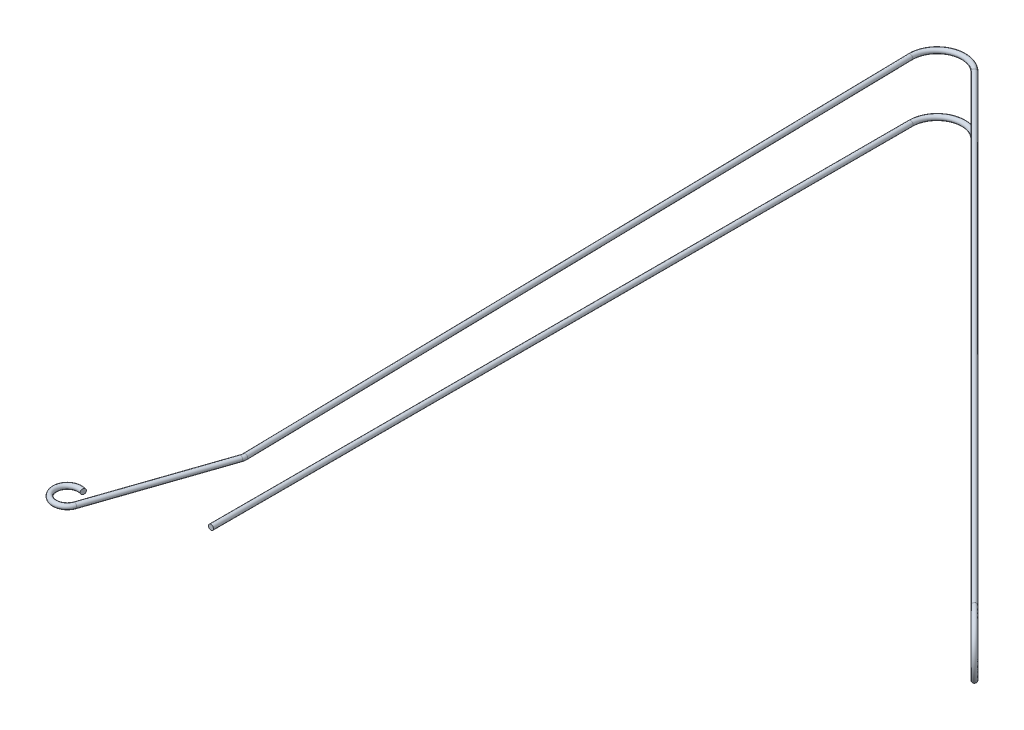
ISO-10303-21;
HEADER;
FILE_DESCRIPTION(('STEP AP214'),'2;1');
FILE_NAME('part.step','',(''),(''),'','','');
FILE_SCHEMA(('AUTOMOTIVE_DESIGN { 1 0 10303 214 1 1 1 1 }'));
ENDSEC;
DATA;
#1=APPLICATION_CONTEXT('core data for automotive mechanical design processes');
#2=APPLICATION_PROTOCOL_DEFINITION('international standard','automotive_design',2000,#1);
#3=PRODUCT_CONTEXT('',#1,'mechanical');
#4=PRODUCT('Part','Part','',(#3));
#5=PRODUCT_RELATED_PRODUCT_CATEGORY('part','',(#4));
#6=PRODUCT_DEFINITION_FORMATION('','',#4);
#7=PRODUCT_DEFINITION_CONTEXT('part definition',#1,'design');
#8=PRODUCT_DEFINITION('design','',#6,#7);
#9=PRODUCT_DEFINITION_SHAPE('','',#8);
#10=(LENGTH_UNIT() NAMED_UNIT(*) SI_UNIT(.MILLI.,.METRE.));
#11=(NAMED_UNIT(*) PLANE_ANGLE_UNIT() SI_UNIT($,.RADIAN.));
#12=(NAMED_UNIT(*) SI_UNIT($,.STERADIAN.) SOLID_ANGLE_UNIT());
#13=UNCERTAINTY_MEASURE_WITH_UNIT(LENGTH_MEASURE(1.E-05),#10,'distance_accuracy_value','');
#14=(GEOMETRIC_REPRESENTATION_CONTEXT(3) GLOBAL_UNCERTAINTY_ASSIGNED_CONTEXT((#13)) GLOBAL_UNIT_ASSIGNED_CONTEXT((#10,
#11,#12)) REPRESENTATION_CONTEXT('',''));
#15=CARTESIAN_POINT('',(0.,0.,0.));
#16=DIRECTION('',(0.,0.,1.));
#17=DIRECTION('',(1.,0.,0.));
#18=AXIS2_PLACEMENT_3D('',#15,#16,#17);
#19=CARTESIAN_POINT('',(0.,0.,0.));
#20=DIRECTION('',(0.,0.,1.));
#21=DIRECTION('',(1.,0.,0.));
#22=AXIS2_PLACEMENT_3D('',#19,#20,#21);
#23=PLANE('',#22);
#24=CARTESIAN_POINT('',(0.,0.,0.));
#25=DIRECTION('',(0.,0.,1.));
#26=DIRECTION('',(1.,0.,0.));
#27=AXIS2_PLACEMENT_3D('',#24,#25,#26);
#28=CIRCLE('',#27,10.);
#29=CARTESIAN_POINT('',(10.,0.,0.));
#30=VERTEX_POINT('',#29);
#31=EDGE_CURVE('E56',#30,#30,#28,.T.);
#32=ORIENTED_EDGE('',*,*,#31,.T.);
#33=EDGE_LOOP('',(#32));
#34=FACE_BOUND('',#33,.T.);
#35=ADVANCED_FACE('F42',(#34),#23,.T.);
#36=CARTESIAN_POINT('',(0.,0.,0.));
#37=DIRECTION('',(0.,0.,-1.));
#38=DIRECTION('',(-1.,0.,0.));
#39=AXIS2_PLACEMENT_3D('',#36,#37,#38);
#40=CYLINDRICAL_SURFACE('',#39,10.);
#41=CARTESIAN_POINT('',(0.,0.,-2783.));
#42=DIRECTION('',(0.,0.,1.));
#43=DIRECTION('',(1.,0.,0.));
#44=AXIS2_PLACEMENT_3D('',#41,#42,#43);
#45=CIRCLE('',#44,10.);
#46=CARTESIAN_POINT('',(-10.0000000000001,0.,-2783.));
#47=VERTEX_POINT('',#46);
#48=EDGE_CURVE('E52',#47,#47,#45,.T.);
#49=ORIENTED_EDGE('',*,*,#48,.T.);
#50=EDGE_LOOP('',(#49));
#51=FACE_BOUND('',#50,.T.);
#52=ORIENTED_EDGE('',*,*,#31,.F.);
#53=EDGE_LOOP('',(#52));
#54=FACE_BOUND('',#53,.T.);
#55=ADVANCED_FACE('F112',(#51,#54),#40,.T.);
#56=CARTESIAN_POINT('',(105.,0.,-2783.));
#57=DIRECTION('',(0.,-1.,0.));
#58=DIRECTION('',(0.,0.,-1.));
#59=AXIS2_PLACEMENT_3D('',#56,#57,#58);
#60=TOROIDAL_SURFACE('',#59,105.,10.);
#61=CARTESIAN_POINT('',(179.246212024588,0.,-2857.24621202459));
#62=DIRECTION('',(-0.707106781186545,0.,-0.70710678118655));
#63=DIRECTION('',(-0.70710678118655,0.,0.707106781186545));
#64=AXIS2_PLACEMENT_3D('',#61,#62,#63);
#65=CIRCLE('',#64,10.);
#66=CARTESIAN_POINT('',(186.317279836453,0.,-2864.31727983645));
#67=VERTEX_POINT('',#66);
#68=EDGE_CURVE('E48',#67,#67,#65,.T.);
#69=CARTESIAN_POINT('',(105.,0.,-2783.));
#70=DIRECTION('',(0.,-1.,0.));
#71=DIRECTION('',(0.,0.,-1.));
#72=AXIS2_PLACEMENT_3D('',#69,#70,#71);
#73=CIRCLE('',#72,115.);
#74=EDGE_CURVE('',#47,#67,#73,.T.);
#75=ORIENTED_EDGE('',*,*,#48,.F.);
#76=ORIENTED_EDGE('',*,*,#68,.T.);
#77=ORIENTED_EDGE('',*,*,#74,.T.);
#78=ORIENTED_EDGE('',*,*,#74,.F.);
#79=EDGE_LOOP('',(#75,#77,#76,#78));
#80=FACE_BOUND('',#79,.T.);
#81=ADVANCED_FACE('F103',(#80),#60,.T.);
#82=CARTESIAN_POINT('',(179.246212024588,0.,-2857.24621202459));
#83=DIRECTION('',(0.707106781186544,0.,0.707106781186551));
#84=DIRECTION('',(0.707106781186551,0.,-0.707106781186544));
#85=AXIS2_PLACEMENT_3D('',#82,#83,#84);
#86=CYLINDRICAL_SURFACE('',#85,10.);
#87=CARTESIAN_POINT('',(2017.7238431096,0.,-1018.76858093955));
#88=DIRECTION('',(-0.707106781186544,0.,-0.707106781186551));
#89=DIRECTION('',(-0.707106781186551,0.,0.707106781186544));
#90=AXIS2_PLACEMENT_3D('',#87,#88,#89);
#91=CIRCLE('',#90,10.);
#92=CARTESIAN_POINT('',(2017.7238431096,-10.0000000000002,-1018.76858093955));
#93=VERTEX_POINT('',#92);
#94=EDGE_CURVE('E11',#93,#93,#91,.T.);
#95=ORIENTED_EDGE('',*,*,#94,.T.);
#96=EDGE_LOOP('',(#95));
#97=FACE_BOUND('',#96,.T.);
#98=ORIENTED_EDGE('',*,*,#68,.F.);
#99=EDGE_LOOP('',(#98));
#100=FACE_BOUND('',#99,.T.);
#101=ADVANCED_FACE('F100',(#97,#100),#86,.T.);
#102=CARTESIAN_POINT('',(2017.7238431096,115.,-1018.76858093955));
#103=DIRECTION('',(-0.707106781186551,0.,0.707106781186544));
#104=DIRECTION('',(0.707106781186544,0.,0.707106781186551));
#105=AXIS2_PLACEMENT_3D('',#102,#103,#104);
#106=TOROIDAL_SURFACE('',#105,115.,10.0000000000002);
#107=CARTESIAN_POINT('',(2017.7238431096,230.,-1018.76858093955));
#108=DIRECTION('',(0.707106781186544,0.,0.707106781186551));
#109=DIRECTION('',(-0.707106781186551,0.,0.707106781186544));
#110=AXIS2_PLACEMENT_3D('',#107,#108,#109);
#111=CIRCLE('',#110,10.0000000000002);
#112=CARTESIAN_POINT('',(2017.7238431096,240.,-1018.76858093955));
#113=VERTEX_POINT('',#112);
#114=EDGE_CURVE('E64',#113,#113,#111,.T.);
#115=CARTESIAN_POINT('',(2017.7238431096,115.,-1018.76858093955));
#116=DIRECTION('',(-0.707106781186551,0.,0.707106781186544));
#117=DIRECTION('',(0.707106781186544,0.,0.707106781186551));
#118=AXIS2_PLACEMENT_3D('',#115,#116,#117);
#119=CIRCLE('',#118,125.);
#120=EDGE_CURVE('',#93,#113,#119,.T.);
#121=ORIENTED_EDGE('',*,*,#94,.F.);
#122=ORIENTED_EDGE('',*,*,#114,.T.);
#123=ORIENTED_EDGE('',*,*,#120,.T.);
#124=ORIENTED_EDGE('',*,*,#120,.F.);
#125=EDGE_LOOP('',(#121,#123,#122,#124));
#126=FACE_BOUND('',#125,.T.);
#127=ADVANCED_FACE('F102',(#126),#106,.T.);
#128=CARTESIAN_POINT('',(2017.7238431096,230.,-1018.76858093955));
#129=DIRECTION('',(-0.707106781186544,0.,-0.707106781186551));
#130=DIRECTION('',(-0.707106781186551,0.,0.707106781186544));
#131=AXIS2_PLACEMENT_3D('',#128,#129,#130);
#132=CYLINDRICAL_SURFACE('',#131,10.0000000000002);
#133=CARTESIAN_POINT('',(179.246212024587,230.,-2857.24621202459));
#134=DIRECTION('',(0.707106781186544,0.,0.707106781186551));
#135=DIRECTION('',(-0.707106781186551,0.,0.707106781186544));
#136=AXIS2_PLACEMENT_3D('',#133,#134,#135);
#137=CIRCLE('',#136,10.0000000000002);
#138=CARTESIAN_POINT('',(186.317279836453,230.,-2864.31727983645));
#139=VERTEX_POINT('',#138);
#140=EDGE_CURVE('E61',#139,#139,#137,.T.);
#141=ORIENTED_EDGE('',*,*,#140,.T.);
#142=EDGE_LOOP('',(#141));
#143=FACE_BOUND('',#142,.T.);
#144=ORIENTED_EDGE('',*,*,#114,.F.);
#145=EDGE_LOOP('',(#144));
#146=FACE_BOUND('',#145,.T.);
#147=ADVANCED_FACE('F108',(#143,#146),#132,.T.);
#148=CARTESIAN_POINT('',(-147.098725341192,230.,360.928191074335));
#149=DIRECTION('',(-0.94636766982169,0.,-0.323091679738529));
#150=DIRECTION('',(-0.323091679738529,0.,0.946367669821691));
#151=AXIS2_PLACEMENT_3D('',#148,#149,#150);
#152=PLANE('',#151);
#153=CARTESIAN_POINT('',(-147.098725341192,230.,360.928191074335));
#154=DIRECTION('',(-0.94636766982169,0.,-0.323091679738529));
#155=DIRECTION('',(-0.323091679738529,0.,0.946367669821691));
#156=AXIS2_PLACEMENT_3D('',#153,#154,#155);
#157=CIRCLE('',#156,10.0000000000005);
#158=CARTESIAN_POINT('',(-143.867808543806,230.,351.464514376116));
#159=VERTEX_POINT('',#158);
#160=EDGE_CURVE('E67',#159,#159,#157,.T.);
#161=ORIENTED_EDGE('',*,*,#160,.F.);
#162=EDGE_LOOP('',(#161));
#163=FACE_BOUND('',#162,.T.);
#164=ADVANCED_FACE('F98',(#163),#152,.F.);
#165=CARTESIAN_POINT('',(105.000000000002,230.,-2783.));
#166=DIRECTION('',(0.,1.,0.));
#167=DIRECTION('',(-1.,0.,0.));
#168=AXIS2_PLACEMENT_3D('',#165,#166,#167);
#169=TOROIDAL_SURFACE('',#168,104.999999999997,10.0000000000005);
#170=CARTESIAN_POINT('',(0.0211492582082862,230.,-2780.89265642773));
#171=DIRECTION('',(-0.0200699387835707,0.,-0.9997985784933));
#172=DIRECTION('',(-0.9997985784933,0.,0.0200699387835706));
#173=AXIS2_PLACEMENT_3D('',#170,#171,#172);
#174=CIRCLE('',#173,10.0000000000005);
#175=CARTESIAN_POINT('',(-9.97683652672551,230.,-2780.69195703989));
#176=VERTEX_POINT('',#175);
#177=EDGE_CURVE('E79',#176,#176,#174,.T.);
#178=CARTESIAN_POINT('',(105.000000000002,230.,-2783.));
#179=DIRECTION('',(0.,1.,0.));
#180=DIRECTION('',(-1.,0.,0.));
#181=AXIS2_PLACEMENT_3D('',#178,#179,#180);
#182=CIRCLE('',#181,114.999999999998);
#183=EDGE_CURVE('',#139,#176,#182,.T.);
#184=ORIENTED_EDGE('',*,*,#140,.F.);
#185=ORIENTED_EDGE('',*,*,#177,.T.);
#186=ORIENTED_EDGE('',*,*,#183,.T.);
#187=ORIENTED_EDGE('',*,*,#183,.F.);
#188=EDGE_LOOP('',(#184,#186,#185,#187));
#189=FACE_BOUND('',#188,.T.);
#190=ADVANCED_FACE('F83',(#189),#169,.T.);
#191=CARTESIAN_POINT('',(0.0211492582087303,230.,-2780.89265642773));
#192=DIRECTION('',(0.0200699387835769,0.,0.9997985784933));
#193=DIRECTION('',(0.9997985784933,0.,-0.0200699387835769));
#194=AXIS2_PLACEMENT_3D('',#191,#192,#193);
#195=CYLINDRICAL_SURFACE('',#194,10.0000000000005);
#196=CARTESIAN_POINT('',(54.2099839738661,230.,-81.436494495815));
#197=DIRECTION('',(-0.0200699387835747,0.,-0.9997985784933));
#198=DIRECTION('',(-0.9997985784933,0.,0.0200699387835747));
#199=AXIS2_PLACEMENT_3D('',#196,#197,#198);
#200=CIRCLE('',#199,10.0000000000005);
#201=CARTESIAN_POINT('',(64.2079697587997,230.,-81.6371938836505));
#202=VERTEX_POINT('',#201);
#203=EDGE_CURVE('E76',#202,#202,#200,.T.);
#204=ORIENTED_EDGE('',*,*,#203,.T.);
#205=EDGE_LOOP('',(#204));
#206=FACE_BOUND('',#205,.T.);
#207=ORIENTED_EDGE('',*,*,#177,.F.);
#208=EDGE_LOOP('',(#207));
#209=FACE_BOUND('',#208,.T.);
#210=ADVANCED_FACE('F86',(#206,#209),#195,.T.);
#211=CARTESIAN_POINT('',(14.2180408341309,230.,-80.633696944473));
#212=DIRECTION('',(0.,-1.,0.));
#213=DIRECTION('',(1.,0.,0.));
#214=AXIS2_PLACEMENT_3D('',#211,#212,#213);
#215=TOROIDAL_SURFACE('',#214,40.0000000000032,10.0000000000005);
#216=CARTESIAN_POINT('',(52.072747627002,230.,-67.7100297549302));
#217=DIRECTION('',(0.323091679738527,0.,-0.946367669821691));
#218=DIRECTION('',(-0.946367669821691,0.,-0.323091679738527));
#219=AXIS2_PLACEMENT_3D('',#216,#217,#218);
#220=CIRCLE('',#219,10.0000000000005);
#221=CARTESIAN_POINT('',(61.5364243252188,230.,-64.4791129575449));
#222=VERTEX_POINT('',#221);
#223=EDGE_CURVE('E73',#222,#222,#220,.T.);
#224=CARTESIAN_POINT('',(14.2180408341309,230.,-80.633696944473));
#225=DIRECTION('',(0.,-1.,0.));
#226=DIRECTION('',(1.,0.,0.));
#227=AXIS2_PLACEMENT_3D('',#224,#225,#226);
#228=CIRCLE('',#227,50.0000000000037);
#229=EDGE_CURVE('',#202,#222,#228,.T.);
#230=ORIENTED_EDGE('',*,*,#203,.F.);
#231=ORIENTED_EDGE('',*,*,#223,.T.);
#232=ORIENTED_EDGE('',*,*,#229,.T.);
#233=ORIENTED_EDGE('',*,*,#229,.F.);
#234=EDGE_LOOP('',(#230,#232,#231,#233));
#235=FACE_BOUND('',#234,.T.);
#236=ADVANCED_FACE('F88',(#235),#215,.T.);
#237=CARTESIAN_POINT('',(52.0727476270015,230.,-67.7100297549302));
#238=DIRECTION('',(-0.323091679738527,0.,0.946367669821691));
#239=DIRECTION('',(0.946367669821691,0.,0.323091679738527));
#240=AXIS2_PLACEMENT_3D('',#237,#238,#239);
#241=CYLINDRICAL_SURFACE('',#240,10.0000000000005);
#242=CARTESIAN_POINT('',(-115.934925837033,230.,424.401158552349));
#243=DIRECTION('',(0.323091679738529,0.,-0.94636766982169));
#244=DIRECTION('',(-0.94636766982169,0.,-0.323091679738529));
#245=AXIS2_PLACEMENT_3D('',#242,#243,#244);
#246=CIRCLE('',#245,10.0000000000005);
#247=CARTESIAN_POINT('',(-106.471249138815,230.,427.632075349735));
#248=VERTEX_POINT('',#247);
#249=EDGE_CURVE('E70',#248,#248,#246,.T.);
#250=CARTESIAN_POINT('',(-106.471249138815,230.,427.632075349735));
#251=CARTESIAN_POINT('',(-104.721169206898,230.,422.505917138201));
#252=CARTESIAN_POINT('',(-102.971089274981,230.,417.379758926666));
#253=CARTESIAN_POINT('',(-99.4709294111471,230.,407.127442503598));
#254=CARTESIAN_POINT('',(-97.7208494792301,230.,402.001284292064));
#255=CARTESIAN_POINT('',(-94.2206896153961,230.,391.748967868996));
#256=CARTESIAN_POINT('',(-92.4706096834791,230.,386.622809657461));
#257=CARTESIAN_POINT('',(-88.970449819645,230.,376.370493234393));
#258=CARTESIAN_POINT('',(-87.220369887728,230.,371.244335022859));
#259=CARTESIAN_POINT('',(-83.7202100238939,230.,360.992018599791));
#260=CARTESIAN_POINT('',(-81.9701300919769,230.,355.865860388257));
#261=CARTESIAN_POINT('',(-78.4699702281429,230.,345.613543965188));
#262=CARTESIAN_POINT('',(-76.7198902962259,230.,340.487385753654));
#263=CARTESIAN_POINT('',(-73.2197304323918,230.,330.235069330586));
#264=CARTESIAN_POINT('',(-71.4696505004748,230.,325.108911119051));
#265=CARTESIAN_POINT('',(-67.9694906366407,230.,314.856594695983));
#266=CARTESIAN_POINT('',(-66.2194107047237,230.,309.730436484449));
#267=CARTESIAN_POINT('',(-62.7192508408897,230.,299.478120061381));
#268=CARTESIAN_POINT('',(-60.9691709089726,230.,294.351961849847));
#269=CARTESIAN_POINT('',(-57.4690110451386,230.,284.099645426778));
#270=CARTESIAN_POINT('',(-55.7189311132216,230.,278.973487215244));
#271=CARTESIAN_POINT('',(-52.2187712493875,230.,268.721170792176));
#272=CARTESIAN_POINT('',(-50.4686913174705,230.,263.595012580642));
#273=CARTESIAN_POINT('',(-46.9685314536364,230.,253.342696157573));
#274=CARTESIAN_POINT('',(-45.2184515217194,230.,248.216537946039));
#275=CARTESIAN_POINT('',(-41.7182916578854,230.,237.964221522971));
#276=CARTESIAN_POINT('',(-39.9682117259683,230.,232.838063311437));
#277=CARTESIAN_POINT('',(-36.4680518621343,230.,222.585746888368));
#278=CARTESIAN_POINT('',(-34.7179719302173,230.,217.459588676834));
#279=CARTESIAN_POINT('',(-31.2178120663832,230.,207.207272253766));
#280=CARTESIAN_POINT('',(-29.4677321344662,230.,202.081114042232));
#281=CARTESIAN_POINT('',(-25.9675722706322,230.,191.828797619163));
#282=CARTESIAN_POINT('',(-24.2174923387152,230.,186.702639407629));
#283=CARTESIAN_POINT('',(-20.7173324748811,230.,176.450322984561));
#284=CARTESIAN_POINT('',(-18.9672525429641,230.,171.324164773027));
#285=CARTESIAN_POINT('',(-15.46709267913,230.,161.071848349958));
#286=CARTESIAN_POINT('',(-13.717012747213,230.,155.945690138424));
#287=CARTESIAN_POINT('',(-10.216852883379,230.,145.693373715356));
#288=CARTESIAN_POINT('',(-8.46677295146193,230.,140.567215503822));
#289=CARTESIAN_POINT('',(-4.96661308762788,230.,130.314899080753));
#290=CARTESIAN_POINT('',(-3.21653315571086,230.,125.188740869219));
#291=CARTESIAN_POINT('',(0.283626708123185,230.,114.936424446151));
#292=CARTESIAN_POINT('',(2.0337066400402,230.,109.810266234617));
#293=CARTESIAN_POINT('',(5.53386650387425,230.,99.5579498115483));
#294=CARTESIAN_POINT('',(7.28394643579128,230.,94.4317916000142));
#295=CARTESIAN_POINT('',(10.7841062996253,230.,84.1794751769458));
#296=CARTESIAN_POINT('',(12.5341862315423,230.,79.0533169654117));
#297=CARTESIAN_POINT('',(16.0343460953764,230.,68.8010005423434));
#298=CARTESIAN_POINT('',(17.7844260272934,230.,63.6748423308092));
#299=CARTESIAN_POINT('',(21.2845858911275,230.,53.4225259077409));
#300=CARTESIAN_POINT('',(23.0346658230445,230.,48.2963676962067));
#301=CARTESIAN_POINT('',(26.5348256868785,230.,38.0440512731384));
#302=CARTESIAN_POINT('',(28.2849056187955,230.,32.9178930616042));
#303=CARTESIAN_POINT('',(31.7850654826296,230.,22.6655766385359));
#304=CARTESIAN_POINT('',(33.5351454145466,230.,17.5394184270017));
#305=CARTESIAN_POINT('',(37.0353052783807,230.,7.28710200393339));
#306=CARTESIAN_POINT('',(38.7853852102977,230.,2.16094379239923));
#307=CARTESIAN_POINT('',(42.2855450741317,230.,-8.0913726306691));
#308=CARTESIAN_POINT('',(44.0356250060488,230.,-13.2175308422033));
#309=CARTESIAN_POINT('',(47.5357848698828,230.,-23.4698472652716));
#310=CARTESIAN_POINT('',(49.2858648017998,230.,-28.5960054768057));
#311=CARTESIAN_POINT('',(52.7860246656339,230.,-38.8483218998741));
#312=CARTESIAN_POINT('',(54.5361045975509,230.,-43.9744801114083));
#313=CARTESIAN_POINT('',(58.0362644613849,230.,-54.2267965344766));
#314=CARTESIAN_POINT('',(59.786344393302,230.,-59.3529547460107));
#315=CARTESIAN_POINT('',(61.536424325219,230.,-64.4791129575449));
#316=B_SPLINE_CURVE_WITH_KNOTS('',3,(#250,#251,#252,#253,#254,#255,#256,#257,#258,#259,#260,
#261,#262,#263,#264,#265,#266,#267,#268,#269,#270,#271,#272,#273,#274,#275,#276,#277,#278,#279,
#280,#281,#282,#283,#284,#285,#286,#287,#288,#289,#290,#291,#292,#293,#294,#295,#296,#297,#298,
#299,#300,#301,#302,#303,#304,#305,#306,#307,#308,#309,#310,#311,#312,#313,#314,#315),
.UNSPECIFIED.,.F.,.F.,(4,2,2,2,2,2,2,2,2,2,2,2,2,2,2,2,2,2,2,2,2,2,2,2,2,2,2,2,2,2,2,2,4),(0.,
16.25,32.5,48.75,65.,81.25,97.5,113.75,130.,146.25,162.5,178.75,195.,211.25,227.5,243.75,260.,
276.25,292.5,308.75,325.,341.25,357.5,373.75,390.,406.25,422.5,438.75,455.,471.25,487.5,503.75,
520.),.UNSPECIFIED.);
#317=EDGE_CURVE('BSEAM95',#248,#222,#316,.T.);
#318=ORIENTED_EDGE('',*,*,#249,.T.);
#319=ORIENTED_EDGE('',*,*,#223,.F.);
#320=ORIENTED_EDGE('',*,*,#317,.T.);
#321=ORIENTED_EDGE('',*,*,#317,.F.);
#322=EDGE_LOOP('',(#318,#320,#319,#321));
#323=FACE_BOUND('',#322,.T.);
#324=ADVANCED_FACE('F95',(#323),#241,.T.);
#325=CARTESIAN_POINT('',(-163.25330932812,230.,408.246574565421));
#326=DIRECTION('',(0.,-1.,0.));
#327=DIRECTION('',(1.,0.,0.));
#328=AXIS2_PLACEMENT_3D('',#325,#326,#327);
#329=TOROIDAL_SURFACE('',#328,50.0000000000035,10.0000000000005);
#330=CARTESIAN_POINT('',(-163.25330932812,230.,408.246574565421));
#331=DIRECTION('',(0.,-1.,0.));
#332=DIRECTION('',(1.,0.,0.));
#333=AXIS2_PLACEMENT_3D('',#330,#331,#332);
#334=CIRCLE('',#333,60.000000000004);
#335=EDGE_CURVE('',#248,#159,#334,.T.);
#336=ORIENTED_EDGE('',*,*,#249,.F.);
#337=ORIENTED_EDGE('',*,*,#160,.T.);
#338=ORIENTED_EDGE('',*,*,#335,.T.);
#339=ORIENTED_EDGE('',*,*,#335,.F.);
#340=EDGE_LOOP('',(#336,#338,#337,#339));
#341=FACE_BOUND('',#340,.T.);
#342=ADVANCED_FACE('F111',(#341),#329,.T.);
#343=CLOSED_SHELL('',(#35,#55,#81,#101,#127,#147,#164,#190,#210,#236,#324,#342));
#344=MANIFOLD_SOLID_BREP('B2',#343);
#345=ADVANCED_BREP_SHAPE_REPRESENTATION('',(#18,#344),#14);
#346=SHAPE_DEFINITION_REPRESENTATION(#9,#345);
ENDSEC;
END-ISO-10303-21;
